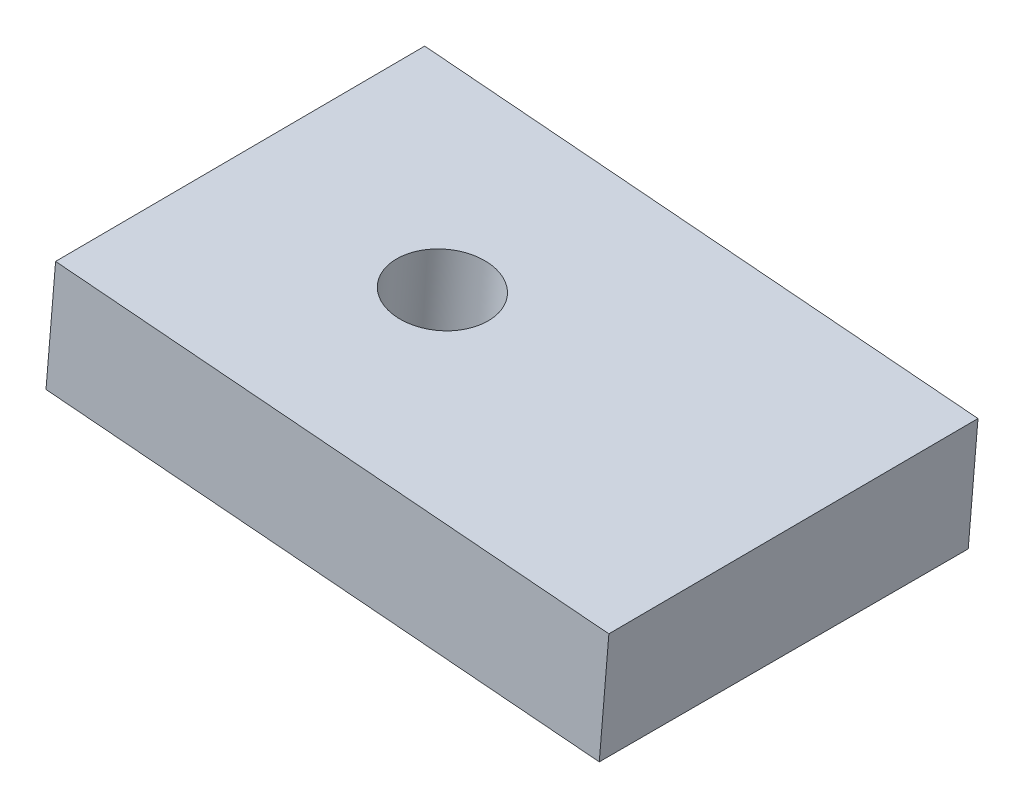
ISO-10303-21;
HEADER;
FILE_DESCRIPTION(('STEP AP214'),'2;1');
FILE_NAME('part.step','',(''),(''),'','','');
FILE_SCHEMA(('AUTOMOTIVE_DESIGN { 1 0 10303 214 1 1 1 1 }'));
ENDSEC;
DATA;
#1=APPLICATION_CONTEXT('core data for automotive mechanical design processes');
#2=APPLICATION_PROTOCOL_DEFINITION('international standard','automotive_design',2000,#1);
#3=PRODUCT_CONTEXT('',#1,'mechanical');
#4=PRODUCT('Part','Part','',(#3));
#5=PRODUCT_RELATED_PRODUCT_CATEGORY('part','',(#4));
#6=PRODUCT_DEFINITION_FORMATION('','',#4);
#7=PRODUCT_DEFINITION_CONTEXT('part definition',#1,'design');
#8=PRODUCT_DEFINITION('design','',#6,#7);
#9=PRODUCT_DEFINITION_SHAPE('','',#8);
#10=(LENGTH_UNIT() NAMED_UNIT(*) SI_UNIT(.MILLI.,.METRE.));
#11=(NAMED_UNIT(*) PLANE_ANGLE_UNIT() SI_UNIT($,.RADIAN.));
#12=(NAMED_UNIT(*) SI_UNIT($,.STERADIAN.) SOLID_ANGLE_UNIT());
#13=UNCERTAINTY_MEASURE_WITH_UNIT(LENGTH_MEASURE(1.E-05),#10,'distance_accuracy_value','');
#14=(GEOMETRIC_REPRESENTATION_CONTEXT(3) GLOBAL_UNCERTAINTY_ASSIGNED_CONTEXT((#13)) GLOBAL_UNIT_ASSIGNED_CONTEXT((#10,
#11,#12)) REPRESENTATION_CONTEXT('',''));
#15=CARTESIAN_POINT('',(0.,0.,0.));
#16=DIRECTION('',(0.,0.,1.));
#17=DIRECTION('',(1.,0.,0.));
#18=AXIS2_PLACEMENT_3D('',#15,#16,#17);
#19=CARTESIAN_POINT('',(-10.2015978551518,-11.9673949808214,0.));
#20=DIRECTION('',(0.996579319521684,-0.0826417564049658,0.));
#21=DIRECTION('',(0.0826417564049658,0.996579319521684,0.));
#22=AXIS2_PLACEMENT_3D('',#19,#20,#21);
#23=PLANE('',#22);
#24=DIRECTION('',(0.,0.,1.));
#25=VECTOR('',#24,1.);
#26=CARTESIAN_POINT('',(-10.4616682072446,-15.1035908434352,0.));
#27=LINE('',#26,#25);
#28=CARTESIAN_POINT('',(-10.4616682072446,-15.1035908434352,0.));
#29=VERTEX_POINT('',#28);
#30=CARTESIAN_POINT('',(-10.4616682072446,-15.1035908434352,10.));
#31=VERTEX_POINT('',#30);
#32=EDGE_CURVE('E120',#29,#31,#27,.T.);
#33=ORIENTED_EDGE('',*,*,#32,.F.);
#34=DIRECTION('',(-0.0826417564049658,-0.996579319521684,0.));
#35=VECTOR('',#34,1.);
#36=CARTESIAN_POINT('',(-10.2015978551518,-11.9673949808214,0.));
#37=LINE('',#36,#35);
#38=CARTESIAN_POINT('',(-10.1968990840286,-11.9107323645818,0.));
#39=VERTEX_POINT('',#38);
#40=EDGE_CURVE('E11',#39,#29,#37,.T.);
#41=ORIENTED_EDGE('',*,*,#40,.F.);
#42=DIRECTION('',(0.000469869517573521,0.00566617003869631,-0.999983836739239));
#43=VECTOR('',#42,1.);
#44=CARTESIAN_POINT('',(-10.2015978551518,-11.9673949808214,10.));
#45=LINE('',#44,#43);
#46=CARTESIAN_POINT('',(-10.2015978551518,-11.9673949808214,10.));
#47=VERTEX_POINT('',#46);
#48=EDGE_CURVE('E101',#39,#47,#45,.F.);
#49=ORIENTED_EDGE('',*,*,#48,.T.);
#50=DIRECTION('',(-0.0826417564049658,-0.996579319521684,0.));
#51=VECTOR('',#50,1.);
#52=CARTESIAN_POINT('',(-10.2015978551518,-11.9673949808214,10.));
#53=LINE('',#52,#51);
#54=EDGE_CURVE('E87',#47,#31,#53,.T.);
#55=ORIENTED_EDGE('',*,*,#54,.T.);
#56=EDGE_LOOP('',(#33,#41,#49,#55));
#57=FACE_BOUND('',#56,.T.);
#58=ADVANCED_FACE('F44',(#57),#23,.T.);
#59=CARTESIAN_POINT('',(-25.1976958972966,-10.7238372858667,0.));
#60=DIRECTION('',(0.,0.,-1.));
#61=DIRECTION('',(-1.,0.,0.));
#62=AXIS2_PLACEMENT_3D('',#59,#60,#61);
#63=PLANE('',#62);
#64=DIRECTION('',(0.996579319521684,-0.0826417564049658,0.));
#65=VECTOR('',#64,1.);
#66=CARTESIAN_POINT('',(-25.4577662493894,-13.8600331484804,0.));
#67=LINE('',#66,#65);
#68=CARTESIAN_POINT('',(-25.4577662493894,-13.8600331484804,0.));
#69=VERTEX_POINT('',#68);
#70=EDGE_CURVE('E106',#69,#29,#67,.T.);
#71=ORIENTED_EDGE('',*,*,#70,.F.);
#72=DIRECTION('',(-0.0826417564049658,-0.996579319521684,0.));
#73=VECTOR('',#72,1.);
#74=CARTESIAN_POINT('',(-25.1976958972966,-10.7238372858667,0.));
#75=LINE('',#74,#73);
#76=CARTESIAN_POINT('',(-25.1929971261734,-10.6671746696271,0.));
#77=VERTEX_POINT('',#76);
#78=EDGE_CURVE('E54',#77,#69,#75,.T.);
#79=ORIENTED_EDGE('',*,*,#78,.F.);
#80=DIRECTION('',(-0.996579319521684,0.0826417564049658,0.));
#81=VECTOR('',#80,1.);
#82=CARTESIAN_POINT('',(-10.1968990840286,-11.9107323645818,0.));
#83=LINE('',#82,#81);
#84=EDGE_CURVE('E96',#77,#39,#83,.F.);
#85=ORIENTED_EDGE('',*,*,#84,.T.);
#86=ORIENTED_EDGE('',*,*,#40,.T.);
#87=EDGE_LOOP('',(#71,#79,#85,#86));
#88=FACE_BOUND('',#87,.T.);
#89=ADVANCED_FACE('F119',(#88),#63,.T.);
#90=CARTESIAN_POINT('',(-25.1976958972966,-10.7238372858667,10.));
#91=DIRECTION('',(-0.996579319521684,0.0826417564049658,0.));
#92=DIRECTION('',(-0.0826417564049658,-0.996579319521684,0.));
#93=AXIS2_PLACEMENT_3D('',#90,#91,#92);
#94=PLANE('',#93);
#95=DIRECTION('',(0.,0.,-1.));
#96=VECTOR('',#95,1.);
#97=CARTESIAN_POINT('',(-25.4577662493894,-13.8600331484804,10.));
#98=LINE('',#97,#96);
#99=CARTESIAN_POINT('',(-25.4577662493894,-13.8600331484804,10.));
#100=VERTEX_POINT('',#99);
#101=EDGE_CURVE('E113',#100,#69,#98,.T.);
#102=ORIENTED_EDGE('',*,*,#101,.F.);
#103=DIRECTION('',(-0.0826417564049658,-0.996579319521684,0.));
#104=VECTOR('',#103,1.);
#105=CARTESIAN_POINT('',(-25.1976958972966,-10.7238372858667,10.));
#106=LINE('',#105,#104);
#107=CARTESIAN_POINT('',(-25.1976958972966,-10.7238372858667,10.));
#108=VERTEX_POINT('',#107);
#109=EDGE_CURVE('E95',#108,#100,#106,.T.);
#110=ORIENTED_EDGE('',*,*,#109,.F.);
#111=DIRECTION('',(-0.000469869517573177,-0.00566617003869634,0.999983836739239));
#112=VECTOR('',#111,1.);
#113=CARTESIAN_POINT('',(-25.1976958972966,-10.7238372858667,10.));
#114=LINE('',#113,#112);
#115=EDGE_CURVE('E102',#108,#77,#114,.F.);
#116=ORIENTED_EDGE('',*,*,#115,.T.);
#117=ORIENTED_EDGE('',*,*,#78,.T.);
#118=EDGE_LOOP('',(#102,#110,#116,#117));
#119=FACE_BOUND('',#118,.T.);
#120=ADVANCED_FACE('F139',(#119),#94,.T.);
#121=CARTESIAN_POINT('',(-10.2015978551518,-11.9673949808214,10.));
#122=DIRECTION('',(0.,0.,1.));
#123=DIRECTION('',(1.,0.,0.));
#124=AXIS2_PLACEMENT_3D('',#121,#122,#123);
#125=PLANE('',#124);
#126=DIRECTION('',(-0.996579319521684,0.0826417564049658,0.));
#127=VECTOR('',#126,1.);
#128=CARTESIAN_POINT('',(-10.4616682072446,-15.1035908434352,10.));
#129=LINE('',#128,#127);
#130=EDGE_CURVE('E92',#31,#100,#129,.T.);
#131=ORIENTED_EDGE('',*,*,#130,.F.);
#132=ORIENTED_EDGE('',*,*,#54,.F.);
#133=DIRECTION('',(-0.996579319521684,0.0826417564049658,0.));
#134=VECTOR('',#133,1.);
#135=CARTESIAN_POINT('',(-10.2015978551518,-11.9673949808214,10.));
#136=LINE('',#135,#134);
#137=EDGE_CURVE('E90',#47,#108,#136,.T.);
#138=ORIENTED_EDGE('',*,*,#137,.T.);
#139=ORIENTED_EDGE('',*,*,#109,.T.);
#140=EDGE_LOOP('',(#131,#132,#138,#139));
#141=FACE_BOUND('',#140,.T.);
#142=ADVANCED_FACE('F89',(#141),#125,.T.);
#143=CARTESIAN_POINT('',(-10.2015978551518,-11.9673949808214,10.));
#144=DIRECTION('',(0.0826404206447073,0.996563211550273,0.00568561872367155));
#145=DIRECTION('',(-0.996579319521684,0.0826417564049658,0.));
#146=AXIS2_PLACEMENT_3D('',#143,#144,#145);
#147=PLANE('',#146);
#148=CARTESIAN_POINT('',(-19.7141602543657,-11.1500356379742,5.));
#149=DIRECTION('',(0.0826404206447073,0.996563211550273,0.00568561872367155));
#150=DIRECTION('',(0.000469869517565879,0.00566617003869695,-0.999983836739239));
#151=AXIS2_PLACEMENT_3D('',#148,#149,#150);
#152=ELLIPSE('',#151,1.25002020440252,1.25);
#153=CARTESIAN_POINT('',(-19.7135729079753,-11.1429528109443,3.75));
#154=VERTEX_POINT('',#153);
#155=EDGE_CURVE('E48',#154,#154,#152,.F.);
#156=ORIENTED_EDGE('',*,*,#155,.T.);
#157=EDGE_LOOP('',(#156));
#158=FACE_BOUND('',#157,.T.);
#159=ORIENTED_EDGE('',*,*,#48,.F.);
#160=ORIENTED_EDGE('',*,*,#84,.F.);
#161=ORIENTED_EDGE('',*,*,#115,.F.);
#162=ORIENTED_EDGE('',*,*,#137,.F.);
#163=EDGE_LOOP('',(#159,#160,#161,#162));
#164=FACE_BOUND('',#163,.T.);
#165=ADVANCED_FACE('F46',(#158,#164),#147,.T.);
#166=CARTESIAN_POINT('',(-1.31536726133734,-15.8620516703576,0.));
#167=DIRECTION('',(-0.0826417564049658,-0.996579319521684,0.));
#168=DIRECTION('',(0.996579319521684,-0.0826417564049658,0.));
#169=AXIS2_PLACEMENT_3D('',#166,#167,#168);
#170=PLANE('',#169);
#171=CARTESIAN_POINT('',(-19.9765799920201,-14.3145628087078,5.));
#172=DIRECTION('',(-0.0826417564049658,-0.996579319521684,0.));
#173=DIRECTION('',(0.996579319521684,-0.0826417564049658,0.));
#174=AXIS2_PLACEMENT_3D('',#171,#172,#173);
#175=CIRCLE('',#174,1.25);
#176=CARTESIAN_POINT('',(-18.730855842618,-14.417865004214,5.));
#177=VERTEX_POINT('',#176);
#178=EDGE_CURVE('E123',#177,#177,#175,.T.);
#179=ORIENTED_EDGE('',*,*,#178,.F.);
#180=EDGE_LOOP('',(#179));
#181=FACE_BOUND('',#180,.T.);
#182=ORIENTED_EDGE('',*,*,#32,.T.);
#183=ORIENTED_EDGE('',*,*,#130,.T.);
#184=ORIENTED_EDGE('',*,*,#101,.T.);
#185=ORIENTED_EDGE('',*,*,#70,.T.);
#186=EDGE_LOOP('',(#182,#183,#184,#185));
#187=FACE_BOUND('',#186,.T.);
#188=ADVANCED_FACE('F126',(#181,#187),#170,.T.);
#189=CARTESIAN_POINT('',(-19.7135729079753,-11.1429528109443,5.));
#190=DIRECTION('',(0.0826417564049658,0.996579319521684,0.));
#191=DIRECTION('',(-0.996579319521684,0.0826417564049658,0.));
#192=AXIS2_PLACEMENT_3D('',#189,#190,#191);
#193=CYLINDRICAL_SURFACE('',#192,1.25);
#194=ORIENTED_EDGE('',*,*,#178,.T.);
#195=EDGE_LOOP('',(#194));
#196=FACE_BOUND('',#195,.T.);
#197=ORIENTED_EDGE('',*,*,#155,.F.);
#198=EDGE_LOOP('',(#197));
#199=FACE_BOUND('',#198,.T.);
#200=ADVANCED_FACE('F176',(#196,#199),#193,.F.);
#201=CLOSED_SHELL('',(#58,#89,#120,#142,#165,#188,#200));
#202=MANIFOLD_SOLID_BREP('B2',#201);
#203=ADVANCED_BREP_SHAPE_REPRESENTATION('',(#18,#202),#14);
#204=SHAPE_DEFINITION_REPRESENTATION(#9,#203);
ENDSEC;
END-ISO-10303-21;
